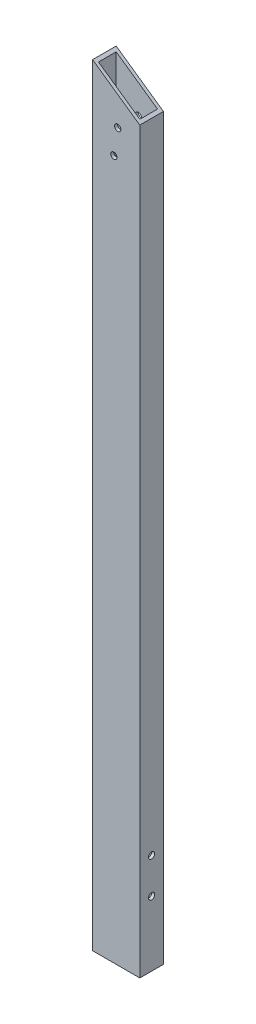
ISO-10303-21;
HEADER;
FILE_DESCRIPTION(('STEP AP214'),'2;1');
FILE_NAME('part.step','',(''),(''),'','','');
FILE_SCHEMA(('AUTOMOTIVE_DESIGN { 1 0 10303 214 1 1 1 1 }'));
ENDSEC;
DATA;
#1=APPLICATION_CONTEXT('core data for automotive mechanical design processes');
#2=APPLICATION_PROTOCOL_DEFINITION('international standard','automotive_design',2000,#1);
#3=PRODUCT_CONTEXT('',#1,'mechanical');
#4=PRODUCT('Part','Part','',(#3));
#5=PRODUCT_RELATED_PRODUCT_CATEGORY('part','',(#4));
#6=PRODUCT_DEFINITION_FORMATION('','',#4);
#7=PRODUCT_DEFINITION_CONTEXT('part definition',#1,'design');
#8=PRODUCT_DEFINITION('design','',#6,#7);
#9=PRODUCT_DEFINITION_SHAPE('','',#8);
#10=(LENGTH_UNIT() NAMED_UNIT(*) SI_UNIT(.MILLI.,.METRE.));
#11=(NAMED_UNIT(*) PLANE_ANGLE_UNIT() SI_UNIT($,.RADIAN.));
#12=(NAMED_UNIT(*) SI_UNIT($,.STERADIAN.) SOLID_ANGLE_UNIT());
#13=UNCERTAINTY_MEASURE_WITH_UNIT(LENGTH_MEASURE(1.E-05),#10,'distance_accuracy_value','');
#14=(GEOMETRIC_REPRESENTATION_CONTEXT(3) GLOBAL_UNCERTAINTY_ASSIGNED_CONTEXT((#13)) GLOBAL_UNIT_ASSIGNED_CONTEXT((#10,
#11,#12)) REPRESENTATION_CONTEXT('',''));
#15=CARTESIAN_POINT('',(0.,0.,0.));
#16=DIRECTION('',(0.,0.,1.));
#17=DIRECTION('',(1.,0.,0.));
#18=AXIS2_PLACEMENT_3D('',#15,#16,#17);
#19=CARTESIAN_POINT('',(-9.16275370058486,752.290972441827,-1003.54760083903));
#20=DIRECTION('',(0.,0.,1.));
#21=DIRECTION('',(1.,0.,0.));
#22=AXIS2_PLACEMENT_3D('',#19,#20,#21);
#23=CYLINDRICAL_SURFACE('',#22,3.3782);
#24=CARTESIAN_POINT('',(-9.16275370058486,752.290972441827,0.617142716306489));
#25=DIRECTION('',(0.,0.,1.));
#26=DIRECTION('',(1.,0.,0.));
#27=AXIS2_PLACEMENT_3D('',#24,#25,#26);
#28=CIRCLE('',#27,3.3782);
#29=CARTESIAN_POINT('',(-5.78455370058486,752.290972441827,0.617142716306489));
#30=VERTEX_POINT('',#29);
#31=EDGE_CURVE('E140',#30,#30,#28,.T.);
#32=ORIENTED_EDGE('',*,*,#31,.F.);
#33=EDGE_LOOP('',(#32));
#34=FACE_BOUND('',#33,.T.);
#35=CARTESIAN_POINT('',(-9.16275370058486,752.290972441827,3.79214271630644));
#36=DIRECTION('',(0.,0.,-1.));
#37=DIRECTION('',(0.,-1.,0.));
#38=AXIS2_PLACEMENT_3D('',#35,#36,#37);
#39=CIRCLE('',#38,3.3782);
#40=CARTESIAN_POINT('',(-9.16275370058486,748.912772441827,3.79214271630644));
#41=VERTEX_POINT('',#40);
#42=EDGE_CURVE('E112',#41,#41,#39,.T.);
#43=ORIENTED_EDGE('',*,*,#42,.F.);
#44=EDGE_LOOP('',(#43));
#45=FACE_BOUND('',#44,.T.);
#46=ADVANCED_FACE('F16',(#34,#45),#23,.F.);
#47=CARTESIAN_POINT('',(-4.9971431797384,780.381855108425,-1003.54760083903));
#48=DIRECTION('',(0.,0.,1.));
#49=DIRECTION('',(1.,0.,0.));
#50=AXIS2_PLACEMENT_3D('',#47,#48,#49);
#51=CYLINDRICAL_SURFACE('',#50,3.3782);
#52=CARTESIAN_POINT('',(-4.9971431797384,780.381855108425,0.617142716306489));
#53=DIRECTION('',(0.,0.,1.));
#54=DIRECTION('',(1.,0.,0.));
#55=AXIS2_PLACEMENT_3D('',#52,#53,#54);
#56=CIRCLE('',#55,3.3782);
#57=CARTESIAN_POINT('',(-1.6189431797384,780.381855108425,0.617142716306489));
#58=VERTEX_POINT('',#57);
#59=EDGE_CURVE('E146',#58,#58,#56,.T.);
#60=ORIENTED_EDGE('',*,*,#59,.F.);
#61=EDGE_LOOP('',(#60));
#62=FACE_BOUND('',#61,.T.);
#63=CARTESIAN_POINT('',(-4.9971431797384,780.381855108425,3.79214271630644));
#64=DIRECTION('',(0.,0.,-1.));
#65=DIRECTION('',(0.,-1.,0.));
#66=AXIS2_PLACEMENT_3D('',#63,#64,#65);
#67=CIRCLE('',#66,3.3782);
#68=CARTESIAN_POINT('',(-4.9971431797384,777.003655108425,3.79214271630644));
#69=VERTEX_POINT('',#68);
#70=EDGE_CURVE('E154',#69,#69,#67,.T.);
#71=ORIENTED_EDGE('',*,*,#70,.F.);
#72=EDGE_LOOP('',(#71));
#73=FACE_BOUND('',#72,.T.);
#74=ADVANCED_FACE('F222',(#62,#73),#51,.F.);
#75=CARTESIAN_POINT('',(-9.162753700585,752.290972441827,985.731886271644));
#76=DIRECTION('',(0.,0.,-1.));
#77=DIRECTION('',(0.,-1.,0.));
#78=AXIS2_PLACEMENT_3D('',#75,#76,#77);
#79=CYLINDRICAL_SURFACE('',#78,3.3782);
#80=CARTESIAN_POINT('',(-9.162753700585,752.290972441827,-18.4328572836935));
#81=DIRECTION('',(0.,0.,-1.));
#82=DIRECTION('',(-1.,0.,0.));
#83=AXIS2_PLACEMENT_3D('',#80,#81,#82);
#84=CIRCLE('',#83,3.3782);
#85=CARTESIAN_POINT('',(-12.540953700585,752.290972441827,-18.4328572836935));
#86=VERTEX_POINT('',#85);
#87=EDGE_CURVE('E137',#86,#86,#84,.T.);
#88=ORIENTED_EDGE('',*,*,#87,.F.);
#89=EDGE_LOOP('',(#88));
#90=FACE_BOUND('',#89,.T.);
#91=CARTESIAN_POINT('',(-9.162753700585,752.290972441827,-21.6078572836935));
#92=DIRECTION('',(0.,0.,1.));
#93=DIRECTION('',(1.,0.,0.));
#94=AXIS2_PLACEMENT_3D('',#91,#92,#93);
#95=CIRCLE('',#94,3.3782);
#96=CARTESIAN_POINT('',(-5.784553700585,752.290972441827,-21.6078572836935));
#97=VERTEX_POINT('',#96);
#98=EDGE_CURVE('E116',#97,#97,#95,.T.);
#99=ORIENTED_EDGE('',*,*,#98,.F.);
#100=EDGE_LOOP('',(#99));
#101=FACE_BOUND('',#100,.T.);
#102=ADVANCED_FACE('F228',(#90,#101),#79,.F.);
#103=CARTESIAN_POINT('',(-4.99714317973854,780.381855108425,985.731886271644));
#104=DIRECTION('',(0.,0.,-1.));
#105=DIRECTION('',(0.,-1.,0.));
#106=AXIS2_PLACEMENT_3D('',#103,#104,#105);
#107=CYLINDRICAL_SURFACE('',#106,3.3782);
#108=CARTESIAN_POINT('',(-4.99714317973854,780.381855108425,-18.4328572836935));
#109=DIRECTION('',(0.,0.,-1.));
#110=DIRECTION('',(-1.,0.,0.));
#111=AXIS2_PLACEMENT_3D('',#108,#109,#110);
#112=CIRCLE('',#111,3.3782);
#113=CARTESIAN_POINT('',(-8.37534317973854,780.381855108425,-18.4328572836935));
#114=VERTEX_POINT('',#113);
#115=EDGE_CURVE('E161',#114,#114,#112,.T.);
#116=ORIENTED_EDGE('',*,*,#115,.F.);
#117=EDGE_LOOP('',(#116));
#118=FACE_BOUND('',#117,.T.);
#119=CARTESIAN_POINT('',(-4.99714317973854,780.381855108425,-21.6078572836935));
#120=DIRECTION('',(0.,0.,1.));
#121=DIRECTION('',(1.,0.,0.));
#122=AXIS2_PLACEMENT_3D('',#119,#120,#121);
#123=CIRCLE('',#122,3.3782);
#124=CARTESIAN_POINT('',(-1.61894317973854,780.381855108425,-21.6078572836935));
#125=VERTEX_POINT('',#124);
#126=EDGE_CURVE('E164',#125,#125,#123,.T.);
#127=ORIENTED_EDGE('',*,*,#126,.F.);
#128=EDGE_LOOP('',(#127));
#129=FACE_BOUND('',#128,.T.);
#130=ADVANCED_FACE('F235',(#118,#129),#107,.F.);
#131=CARTESIAN_POINT('',(847.849997651536,69.85,-8.90785728369403));
#132=DIRECTION('',(-1.,0.,0.));
#133=DIRECTION('',(0.,1.,0.));
#134=AXIS2_PLACEMENT_3D('',#131,#132,#133);
#135=CYLINDRICAL_SURFACE('',#134,3.3782);
#136=CARTESIAN_POINT('',(18.7587744536941,69.85,-8.90785728369345));
#137=DIRECTION('',(-1.,0.,0.));
#138=DIRECTION('',(0.,1.,0.));
#139=AXIS2_PLACEMENT_3D('',#136,#137,#138);
#140=CIRCLE('',#139,3.3782);
#141=CARTESIAN_POINT('',(18.7587744536941,73.2282,-8.90785728369345));
#142=VERTEX_POINT('',#141);
#143=EDGE_CURVE('E170',#142,#142,#140,.T.);
#144=ORIENTED_EDGE('',*,*,#143,.F.);
#145=EDGE_LOOP('',(#144));
#146=FACE_BOUND('',#145,.T.);
#147=CARTESIAN_POINT('',(15.5837744536942,69.85,-8.90785728369345));
#148=DIRECTION('',(1.,0.,0.));
#149=DIRECTION('',(0.,1.,0.));
#150=AXIS2_PLACEMENT_3D('',#147,#148,#149);
#151=CIRCLE('',#150,3.3782);
#152=CARTESIAN_POINT('',(15.5837744536942,73.2282,-8.90785728369345));
#153=VERTEX_POINT('',#152);
#154=EDGE_CURVE('E26',#153,#153,#151,.T.);
#155=ORIENTED_EDGE('',*,*,#154,.F.);
#156=EDGE_LOOP('',(#155));
#157=FACE_BOUND('',#156,.T.);
#158=ADVANCED_FACE('F239',(#146,#157),#135,.F.);
#159=CARTESIAN_POINT('',(847.849997651536,107.95,-8.90785728369403));
#160=DIRECTION('',(-1.,0.,0.));
#161=DIRECTION('',(0.,1.,0.));
#162=AXIS2_PLACEMENT_3D('',#159,#160,#161);
#163=CYLINDRICAL_SURFACE('',#162,3.3782);
#164=CARTESIAN_POINT('',(18.7587744536941,107.95,-8.90785728369345));
#165=DIRECTION('',(-1.,0.,0.));
#166=DIRECTION('',(0.,1.,0.));
#167=AXIS2_PLACEMENT_3D('',#164,#165,#166);
#168=CIRCLE('',#167,3.3782);
#169=CARTESIAN_POINT('',(18.7587744536941,111.3282,-8.90785728369345));
#170=VERTEX_POINT('',#169);
#171=EDGE_CURVE('E173',#170,#170,#168,.T.);
#172=ORIENTED_EDGE('',*,*,#171,.F.);
#173=EDGE_LOOP('',(#172));
#174=FACE_BOUND('',#173,.T.);
#175=CARTESIAN_POINT('',(15.5837744536942,107.95,-8.90785728369345));
#176=DIRECTION('',(1.,0.,0.));
#177=DIRECTION('',(0.,1.,0.));
#178=AXIS2_PLACEMENT_3D('',#175,#176,#177);
#179=CIRCLE('',#178,3.3782);
#180=CARTESIAN_POINT('',(15.5837744536942,111.3282,-8.90785728369345));
#181=VERTEX_POINT('',#180);
#182=EDGE_CURVE('E176',#181,#181,#179,.T.);
#183=ORIENTED_EDGE('',*,*,#182,.F.);
#184=EDGE_LOOP('',(#183));
#185=FACE_BOUND('',#184,.T.);
#186=ADVANCED_FACE('F243',(#174,#185),#163,.F.);
#187=CARTESIAN_POINT('',(800.224997651536,69.85,-8.90785728369374));
#188=DIRECTION('',(-1.,0.,0.));
#189=DIRECTION('',(0.,1.,0.));
#190=AXIS2_PLACEMENT_3D('',#187,#188,#189);
#191=CYLINDRICAL_SURFACE('',#190,3.3782);
#192=CARTESIAN_POINT('',(-28.8662255463059,69.85,-8.90785728369345));
#193=DIRECTION('',(-1.,0.,0.));
#194=DIRECTION('',(0.,1.,0.));
#195=AXIS2_PLACEMENT_3D('',#192,#193,#194);
#196=CIRCLE('',#195,3.3782);
#197=CARTESIAN_POINT('',(-28.8662255463059,73.2282,-8.90785728369345));
#198=VERTEX_POINT('',#197);
#199=EDGE_CURVE('E181',#198,#198,#196,.T.);
#200=ORIENTED_EDGE('',*,*,#199,.F.);
#201=EDGE_LOOP('',(#200));
#202=FACE_BOUND('',#201,.T.);
#203=CARTESIAN_POINT('',(-32.0412255463059,69.85,-8.90785728369344));
#204=DIRECTION('',(1.,0.,0.));
#205=DIRECTION('',(0.,1.,0.));
#206=AXIS2_PLACEMENT_3D('',#203,#204,#205);
#207=CIRCLE('',#206,3.3782);
#208=CARTESIAN_POINT('',(-32.0412255463059,73.2282,-8.90785728369344));
#209=VERTEX_POINT('',#208);
#210=EDGE_CURVE('E123',#209,#209,#207,.T.);
#211=ORIENTED_EDGE('',*,*,#210,.F.);
#212=EDGE_LOOP('',(#211));
#213=FACE_BOUND('',#212,.T.);
#214=ADVANCED_FACE('F247',(#202,#213),#191,.F.);
#215=CARTESIAN_POINT('',(800.224997651536,107.95,-8.90785728369374));
#216=DIRECTION('',(-1.,0.,0.));
#217=DIRECTION('',(0.,1.,0.));
#218=AXIS2_PLACEMENT_3D('',#215,#216,#217);
#219=CYLINDRICAL_SURFACE('',#218,3.3782);
#220=CARTESIAN_POINT('',(-28.8662255463059,107.95,-8.90785728369345));
#221=DIRECTION('',(-1.,0.,0.));
#222=DIRECTION('',(0.,1.,0.));
#223=AXIS2_PLACEMENT_3D('',#220,#221,#222);
#224=CIRCLE('',#223,3.3782);
#225=CARTESIAN_POINT('',(-28.8662255463059,111.3282,-8.90785728369345));
#226=VERTEX_POINT('',#225);
#227=EDGE_CURVE('E143',#226,#226,#224,.T.);
#228=ORIENTED_EDGE('',*,*,#227,.F.);
#229=EDGE_LOOP('',(#228));
#230=FACE_BOUND('',#229,.T.);
#231=CARTESIAN_POINT('',(-32.0412255463059,107.95,-8.90785728369344));
#232=DIRECTION('',(1.,0.,0.));
#233=DIRECTION('',(0.,1.,0.));
#234=AXIS2_PLACEMENT_3D('',#231,#232,#233);
#235=CIRCLE('',#234,3.3782);
#236=CARTESIAN_POINT('',(-32.0412255463059,111.3282,-8.90785728369344));
#237=VERTEX_POINT('',#236);
#238=EDGE_CURVE('E115',#237,#237,#235,.T.);
#239=ORIENTED_EDGE('',*,*,#238,.F.);
#240=EDGE_LOOP('',(#239));
#241=FACE_BOUND('',#240,.T.);
#242=ADVANCED_FACE('F251',(#230,#241),#219,.F.);
#243=CARTESIAN_POINT('',(18.7587744536942,794.755457058947,3.79214271630647));
#244=DIRECTION('',(-0.573576436351046,-0.819152044288992,0.));
#245=DIRECTION('',(0.819152044288992,-0.573576436351046,0.));
#246=AXIS2_PLACEMENT_3D('',#243,#244,#245);
#247=PLANE('',#246);
#248=DIRECTION('',(0.,0.,1.));
#249=VECTOR('',#248,1.);
#250=CARTESIAN_POINT('',(-28.8662255463058,828.102841066184,-7.32035728369346));
#251=LINE('',#250,#249);
#252=CARTESIAN_POINT('',(-28.8662255463058,828.102841066184,-18.4328572836935));
#253=VERTEX_POINT('',#252);
#254=CARTESIAN_POINT('',(-28.8662255463058,828.102841066184,0.617142716306469));
#255=VERTEX_POINT('',#254);
#256=EDGE_CURVE('E35',#253,#255,#251,.T.);
#257=ORIENTED_EDGE('',*,*,#256,.F.);
#258=DIRECTION('',(-0.819152044288992,0.573576436351046,0.));
#259=VECTOR('',#258,1.);
#260=CARTESIAN_POINT('',(204.400005546836,664.768067644998,-18.4328572836936));
#261=LINE('',#260,#259);
#262=CARTESIAN_POINT('',(15.5837744536942,796.978615992763,-18.4328572836935));
#263=VERTEX_POINT('',#262);
#264=EDGE_CURVE('E167',#263,#253,#261,.T.);
#265=ORIENTED_EDGE('',*,*,#264,.F.);
#266=DIRECTION('',(0.,0.,-1.));
#267=VECTOR('',#266,1.);
#268=CARTESIAN_POINT('',(15.5837744536942,796.978615992763,2.20464271630666));
#269=LINE('',#268,#267);
#270=CARTESIAN_POINT('',(15.5837744536942,796.978615992763,0.617142716306464));
#271=VERTEX_POINT('',#270);
#272=EDGE_CURVE('E136',#271,#263,#269,.T.);
#273=ORIENTED_EDGE('',*,*,#272,.F.);
#274=DIRECTION('',(0.819152044288992,-0.573576436351046,0.));
#275=VECTOR('',#274,1.);
#276=CARTESIAN_POINT('',(189.486806704129,675.210401893482,0.617142716306442));
#277=LINE('',#276,#275);
#278=EDGE_CURVE('E122',#255,#271,#277,.T.);
#279=ORIENTED_EDGE('',*,*,#278,.F.);
#280=EDGE_LOOP('',(#257,#265,#273,#279));
#281=FACE_BOUND('',#280,.T.);
#282=DIRECTION('',(-0.819152044288992,0.573576436351046,0.));
#283=VECTOR('',#282,1.);
#284=CARTESIAN_POINT('',(188.421578215364,675.956282911231,3.79214271630647));
#285=LINE('',#284,#283);
#286=CARTESIAN_POINT('',(18.7587744536942,794.755457058947,3.79214271630647));
#287=VERTEX_POINT('',#286);
#288=CARTESIAN_POINT('',(-32.0412255463058,830.326,3.79214271630647));
#289=VERTEX_POINT('',#288);
#290=EDGE_CURVE('E158',#287,#289,#285,.T.);
#291=ORIENTED_EDGE('',*,*,#290,.F.);
#292=DIRECTION('',(0.,0.,1.));
#293=VECTOR('',#292,1.);
#294=CARTESIAN_POINT('',(18.7587744536942,794.755457058947,3.79214271630659));
#295=LINE('',#294,#293);
#296=CARTESIAN_POINT('',(18.7587744536942,794.755457058947,-21.6078572836935));
#297=VERTEX_POINT('',#296);
#298=EDGE_CURVE('E111',#297,#287,#295,.T.);
#299=ORIENTED_EDGE('',*,*,#298,.F.);
#300=DIRECTION('',(0.819152044288992,-0.573576436351046,0.));
#301=VECTOR('',#300,1.);
#302=CARTESIAN_POINT('',(205.4652340356,664.02218662725,-21.6078572836935));
#303=LINE('',#302,#301);
#304=CARTESIAN_POINT('',(-32.0412255463058,830.326,-21.6078572836935));
#305=VERTEX_POINT('',#304);
#306=EDGE_CURVE('E98',#305,#297,#303,.T.);
#307=ORIENTED_EDGE('',*,*,#306,.F.);
#308=DIRECTION('',(0.,0.,1.));
#309=VECTOR('',#308,1.);
#310=CARTESIAN_POINT('',(-32.0412255463058,830.326,3.79214271630647));
#311=LINE('',#310,#309);
#312=EDGE_CURVE('E11',#305,#289,#311,.T.);
#313=ORIENTED_EDGE('',*,*,#312,.T.);
#314=EDGE_LOOP('',(#291,#299,#307,#313));
#315=FACE_BOUND('',#314,.T.);
#316=ADVANCED_FACE('F199',(#281,#315),#247,.F.);
#317=CARTESIAN_POINT('',(15.5837744536942,0.,0.617142716306464));
#318=DIRECTION('',(1.,0.,0.));
#319=DIRECTION('',(0.,0.,-1.));
#320=AXIS2_PLACEMENT_3D('',#317,#318,#319);
#321=PLANE('',#320);
#322=ORIENTED_EDGE('',*,*,#154,.T.);
#323=EDGE_LOOP('',(#322));
#324=FACE_BOUND('',#323,.T.);
#325=ORIENTED_EDGE('',*,*,#182,.T.);
#326=EDGE_LOOP('',(#325));
#327=FACE_BOUND('',#326,.T.);
#328=ORIENTED_EDGE('',*,*,#272,.T.);
#329=DIRECTION('',(0.,1.,0.));
#330=VECTOR('',#329,1.);
#331=CARTESIAN_POINT('',(15.5837744536942,0.,-18.4328572836935));
#332=LINE('',#331,#330);
#333=CARTESIAN_POINT('',(15.5837744536942,0.,-18.4328572836935));
#334=VERTEX_POINT('',#333);
#335=EDGE_CURVE('E132',#334,#263,#332,.T.);
#336=ORIENTED_EDGE('',*,*,#335,.F.);
#337=DIRECTION('',(0.,0.,-1.));
#338=VECTOR('',#337,1.);
#339=CARTESIAN_POINT('',(15.5837744536942,0.,-4.14535728369355));
#340=LINE('',#339,#338);
#341=CARTESIAN_POINT('',(15.5837744536942,0.,0.617142716306464));
#342=VERTEX_POINT('',#341);
#343=EDGE_CURVE('E126',#342,#334,#340,.T.);
#344=ORIENTED_EDGE('',*,*,#343,.F.);
#345=DIRECTION('',(0.,1.,0.));
#346=VECTOR('',#345,1.);
#347=CARTESIAN_POINT('',(15.5837744536942,0.,0.617142716306464));
#348=LINE('',#347,#346);
#349=EDGE_CURVE('E133',#342,#271,#348,.T.);
#350=ORIENTED_EDGE('',*,*,#349,.T.);
#351=EDGE_LOOP('',(#328,#336,#344,#350));
#352=FACE_BOUND('',#351,.T.);
#353=ADVANCED_FACE('F258',(#324,#327,#352),#321,.F.);
#354=CARTESIAN_POINT('',(15.5837744536942,0.,-18.4328572836935));
#355=DIRECTION('',(0.,0.,-1.));
#356=DIRECTION('',(-1.,0.,0.));
#357=AXIS2_PLACEMENT_3D('',#354,#355,#356);
#358=PLANE('',#357);
#359=ORIENTED_EDGE('',*,*,#87,.T.);
#360=EDGE_LOOP('',(#359));
#361=FACE_BOUND('',#360,.T.);
#362=ORIENTED_EDGE('',*,*,#115,.T.);
#363=EDGE_LOOP('',(#362));
#364=FACE_BOUND('',#363,.T.);
#365=ORIENTED_EDGE('',*,*,#264,.T.);
#366=DIRECTION('',(0.,1.,0.));
#367=VECTOR('',#366,1.);
#368=CARTESIAN_POINT('',(-28.8662255463058,0.,-18.4328572836935));
#369=LINE('',#368,#367);
#370=CARTESIAN_POINT('',(-28.8662255463058,0.,-18.4328572836935));
#371=VERTEX_POINT('',#370);
#372=EDGE_CURVE('E138',#371,#253,#369,.T.);
#373=ORIENTED_EDGE('',*,*,#372,.F.);
#374=DIRECTION('',(-1.,0.,0.));
#375=VECTOR('',#374,1.);
#376=CARTESIAN_POINT('',(4.47127445369416,0.,-18.4328572836935));
#377=LINE('',#376,#375);
#378=EDGE_CURVE('E118',#334,#371,#377,.T.);
#379=ORIENTED_EDGE('',*,*,#378,.F.);
#380=ORIENTED_EDGE('',*,*,#335,.T.);
#381=EDGE_LOOP('',(#365,#373,#379,#380));
#382=FACE_BOUND('',#381,.T.);
#383=ADVANCED_FACE('F217',(#361,#364,#382),#358,.F.);
#384=CARTESIAN_POINT('',(18.7587744536942,0.,3.79214271630647));
#385=DIRECTION('',(1.,0.,0.));
#386=DIRECTION('',(0.,0.,-1.));
#387=AXIS2_PLACEMENT_3D('',#384,#385,#386);
#388=PLANE('',#387);
#389=ORIENTED_EDGE('',*,*,#143,.T.);
#390=EDGE_LOOP('',(#389));
#391=FACE_BOUND('',#390,.T.);
#392=ORIENTED_EDGE('',*,*,#171,.T.);
#393=EDGE_LOOP('',(#392));
#394=FACE_BOUND('',#393,.T.);
#395=ORIENTED_EDGE('',*,*,#298,.T.);
#396=DIRECTION('',(0.,1.,0.));
#397=VECTOR('',#396,1.);
#398=CARTESIAN_POINT('',(18.7587744536942,0.,3.79214271630647));
#399=LINE('',#398,#397);
#400=CARTESIAN_POINT('',(18.7587744536942,0.,3.79214271630647));
#401=VERTEX_POINT('',#400);
#402=EDGE_CURVE('E108',#401,#287,#399,.T.);
#403=ORIENTED_EDGE('',*,*,#402,.F.);
#404=DIRECTION('',(0.,0.,1.));
#405=VECTOR('',#404,1.);
#406=CARTESIAN_POINT('',(18.7587744536942,0.,-21.6078572836935));
#407=LINE('',#406,#405);
#408=CARTESIAN_POINT('',(18.7587744536942,0.,-21.6078572836935));
#409=VERTEX_POINT('',#408);
#410=EDGE_CURVE('E103',#409,#401,#407,.T.);
#411=ORIENTED_EDGE('',*,*,#410,.F.);
#412=DIRECTION('',(0.,1.,0.));
#413=VECTOR('',#412,1.);
#414=CARTESIAN_POINT('',(18.7587744536942,0.,-21.6078572836935));
#415=LINE('',#414,#413);
#416=EDGE_CURVE('E102',#409,#297,#415,.T.);
#417=ORIENTED_EDGE('',*,*,#416,.T.);
#418=EDGE_LOOP('',(#395,#403,#411,#417));
#419=FACE_BOUND('',#418,.T.);
#420=ADVANCED_FACE('F202',(#391,#394,#419),#388,.T.);
#421=CARTESIAN_POINT('',(-32.0412255463058,0.,3.79214271630647));
#422=DIRECTION('',(0.,0.,1.));
#423=DIRECTION('',(1.,0.,0.));
#424=AXIS2_PLACEMENT_3D('',#421,#422,#423);
#425=PLANE('',#424);
#426=ORIENTED_EDGE('',*,*,#42,.T.);
#427=EDGE_LOOP('',(#426));
#428=FACE_BOUND('',#427,.T.);
#429=ORIENTED_EDGE('',*,*,#70,.T.);
#430=EDGE_LOOP('',(#429));
#431=FACE_BOUND('',#430,.T.);
#432=ORIENTED_EDGE('',*,*,#290,.T.);
#433=DIRECTION('',(0.,1.,0.));
#434=VECTOR('',#433,1.);
#435=CARTESIAN_POINT('',(-32.0412255463058,0.,3.79214271630647));
#436=LINE('',#435,#434);
#437=CARTESIAN_POINT('',(-32.0412255463058,0.,3.79214271630647));
#438=VERTEX_POINT('',#437);
#439=EDGE_CURVE('E113',#438,#289,#436,.T.);
#440=ORIENTED_EDGE('',*,*,#439,.F.);
#441=DIRECTION('',(-1.,0.,0.));
#442=VECTOR('',#441,1.);
#443=CARTESIAN_POINT('',(18.7587744536942,0.,3.79214271630647));
#444=LINE('',#443,#442);
#445=EDGE_CURVE('E88',#401,#438,#444,.T.);
#446=ORIENTED_EDGE('',*,*,#445,.F.);
#447=ORIENTED_EDGE('',*,*,#402,.T.);
#448=EDGE_LOOP('',(#432,#440,#446,#447));
#449=FACE_BOUND('',#448,.T.);
#450=ADVANCED_FACE('F204',(#428,#431,#449),#425,.T.);
#451=CARTESIAN_POINT('',(-28.8662255463058,0.,-18.4328572836935));
#452=DIRECTION('',(-1.,0.,0.));
#453=DIRECTION('',(0.,0.,1.));
#454=AXIS2_PLACEMENT_3D('',#451,#452,#453);
#455=PLANE('',#454);
#456=ORIENTED_EDGE('',*,*,#199,.T.);
#457=EDGE_LOOP('',(#456));
#458=FACE_BOUND('',#457,.T.);
#459=ORIENTED_EDGE('',*,*,#227,.T.);
#460=EDGE_LOOP('',(#459));
#461=FACE_BOUND('',#460,.T.);
#462=ORIENTED_EDGE('',*,*,#256,.T.);
#463=DIRECTION('',(0.,1.,0.));
#464=VECTOR('',#463,1.);
#465=CARTESIAN_POINT('',(-28.8662255463058,0.,0.617142716306469));
#466=LINE('',#465,#464);
#467=CARTESIAN_POINT('',(-28.8662255463058,0.,0.617142716306469));
#468=VERTEX_POINT('',#467);
#469=EDGE_CURVE('E119',#468,#255,#466,.T.);
#470=ORIENTED_EDGE('',*,*,#469,.F.);
#471=DIRECTION('',(0.,0.,1.));
#472=VECTOR('',#471,1.);
#473=CARTESIAN_POINT('',(-28.8662255463058,0.,-13.6703572836935));
#474=LINE('',#473,#472);
#475=EDGE_CURVE('E78',#371,#468,#474,.T.);
#476=ORIENTED_EDGE('',*,*,#475,.F.);
#477=ORIENTED_EDGE('',*,*,#372,.T.);
#478=EDGE_LOOP('',(#462,#470,#476,#477));
#479=FACE_BOUND('',#478,.T.);
#480=ADVANCED_FACE('F206',(#458,#461,#479),#455,.F.);
#481=CARTESIAN_POINT('',(-28.8662255463058,0.,0.617142716306469));
#482=DIRECTION('',(0.,0.,1.));
#483=DIRECTION('',(1.,0.,0.));
#484=AXIS2_PLACEMENT_3D('',#481,#482,#483);
#485=PLANE('',#484);
#486=ORIENTED_EDGE('',*,*,#31,.T.);
#487=EDGE_LOOP('',(#486));
#488=FACE_BOUND('',#487,.T.);
#489=ORIENTED_EDGE('',*,*,#59,.T.);
#490=EDGE_LOOP('',(#489));
#491=FACE_BOUND('',#490,.T.);
#492=ORIENTED_EDGE('',*,*,#278,.T.);
#493=ORIENTED_EDGE('',*,*,#349,.F.);
#494=DIRECTION('',(1.,0.,0.));
#495=VECTOR('',#494,1.);
#496=CARTESIAN_POINT('',(-17.7537255463058,0.,0.617142716306467));
#497=LINE('',#496,#495);
#498=EDGE_CURVE('E125',#468,#342,#497,.T.);
#499=ORIENTED_EDGE('',*,*,#498,.F.);
#500=ORIENTED_EDGE('',*,*,#469,.T.);
#501=EDGE_LOOP('',(#492,#493,#499,#500));
#502=FACE_BOUND('',#501,.T.);
#503=ADVANCED_FACE('F214',(#488,#491,#502),#485,.F.);
#504=CARTESIAN_POINT('',(-32.0412255463058,0.,-21.6078572836935));
#505=DIRECTION('',(-1.,0.,0.));
#506=DIRECTION('',(0.,0.,1.));
#507=AXIS2_PLACEMENT_3D('',#504,#505,#506);
#508=PLANE('',#507);
#509=ORIENTED_EDGE('',*,*,#210,.T.);
#510=EDGE_LOOP('',(#509));
#511=FACE_BOUND('',#510,.T.);
#512=ORIENTED_EDGE('',*,*,#238,.T.);
#513=EDGE_LOOP('',(#512));
#514=FACE_BOUND('',#513,.T.);
#515=DIRECTION('',(0.,0.,-1.));
#516=VECTOR('',#515,1.);
#517=CARTESIAN_POINT('',(-32.0412255463058,0.,3.79214271630647));
#518=LINE('',#517,#516);
#519=CARTESIAN_POINT('',(-32.0412255463058,0.,-21.6078572836935));
#520=VERTEX_POINT('',#519);
#521=EDGE_CURVE('E84',#438,#520,#518,.T.);
#522=ORIENTED_EDGE('',*,*,#521,.F.);
#523=ORIENTED_EDGE('',*,*,#439,.T.);
#524=ORIENTED_EDGE('',*,*,#312,.F.);
#525=DIRECTION('',(0.,1.,0.));
#526=VECTOR('',#525,1.);
#527=CARTESIAN_POINT('',(-32.0412255463058,0.,-21.6078572836935));
#528=LINE('',#527,#526);
#529=EDGE_CURVE('E95',#520,#305,#528,.T.);
#530=ORIENTED_EDGE('',*,*,#529,.F.);
#531=EDGE_LOOP('',(#522,#523,#524,#530));
#532=FACE_BOUND('',#531,.T.);
#533=ADVANCED_FACE('F96',(#511,#514,#532),#508,.T.);
#534=CARTESIAN_POINT('',(18.7587744536942,0.,-21.6078572836935));
#535=DIRECTION('',(0.,0.,-1.));
#536=DIRECTION('',(-1.,0.,0.));
#537=AXIS2_PLACEMENT_3D('',#534,#535,#536);
#538=PLANE('',#537);
#539=ORIENTED_EDGE('',*,*,#98,.T.);
#540=EDGE_LOOP('',(#539));
#541=FACE_BOUND('',#540,.T.);
#542=ORIENTED_EDGE('',*,*,#126,.T.);
#543=EDGE_LOOP('',(#542));
#544=FACE_BOUND('',#543,.T.);
#545=ORIENTED_EDGE('',*,*,#306,.T.);
#546=ORIENTED_EDGE('',*,*,#416,.F.);
#547=DIRECTION('',(1.,0.,0.));
#548=VECTOR('',#547,1.);
#549=CARTESIAN_POINT('',(-32.0412255463058,0.,-21.6078572836935));
#550=LINE('',#549,#548);
#551=EDGE_CURVE('E20',#520,#409,#550,.T.);
#552=ORIENTED_EDGE('',*,*,#551,.F.);
#553=ORIENTED_EDGE('',*,*,#529,.T.);
#554=EDGE_LOOP('',(#545,#546,#552,#553));
#555=FACE_BOUND('',#554,.T.);
#556=ADVANCED_FACE('F100',(#541,#544,#555),#538,.T.);
#557=CARTESIAN_POINT('',(-6.64122554630584,0.,-8.90785728369354));
#558=DIRECTION('',(0.,-1.,0.));
#559=DIRECTION('',(1.,0.,0.));
#560=AXIS2_PLACEMENT_3D('',#557,#558,#559);
#561=PLANE('',#560);
#562=ORIENTED_EDGE('',*,*,#475,.T.);
#563=ORIENTED_EDGE('',*,*,#498,.T.);
#564=ORIENTED_EDGE('',*,*,#343,.T.);
#565=ORIENTED_EDGE('',*,*,#378,.T.);
#566=EDGE_LOOP('',(#562,#563,#564,#565));
#567=FACE_BOUND('',#566,.T.);
#568=ORIENTED_EDGE('',*,*,#445,.T.);
#569=ORIENTED_EDGE('',*,*,#521,.T.);
#570=ORIENTED_EDGE('',*,*,#551,.T.);
#571=ORIENTED_EDGE('',*,*,#410,.T.);
#572=EDGE_LOOP('',(#568,#569,#570,#571));
#573=FACE_BOUND('',#572,.T.);
#574=ADVANCED_FACE('F18',(#567,#573),#561,.T.);
#575=CLOSED_SHELL('',(#46,#74,#102,#130,#158,#186,#214,#242,#316,#353,#383,#420,#450,#480,#503,
#533,#556,#574));
#576=MANIFOLD_SOLID_BREP('B1',#575);
#577=ADVANCED_BREP_SHAPE_REPRESENTATION('',(#18,#576),#14);
#578=SHAPE_DEFINITION_REPRESENTATION(#9,#577);
ENDSEC;
END-ISO-10303-21;
